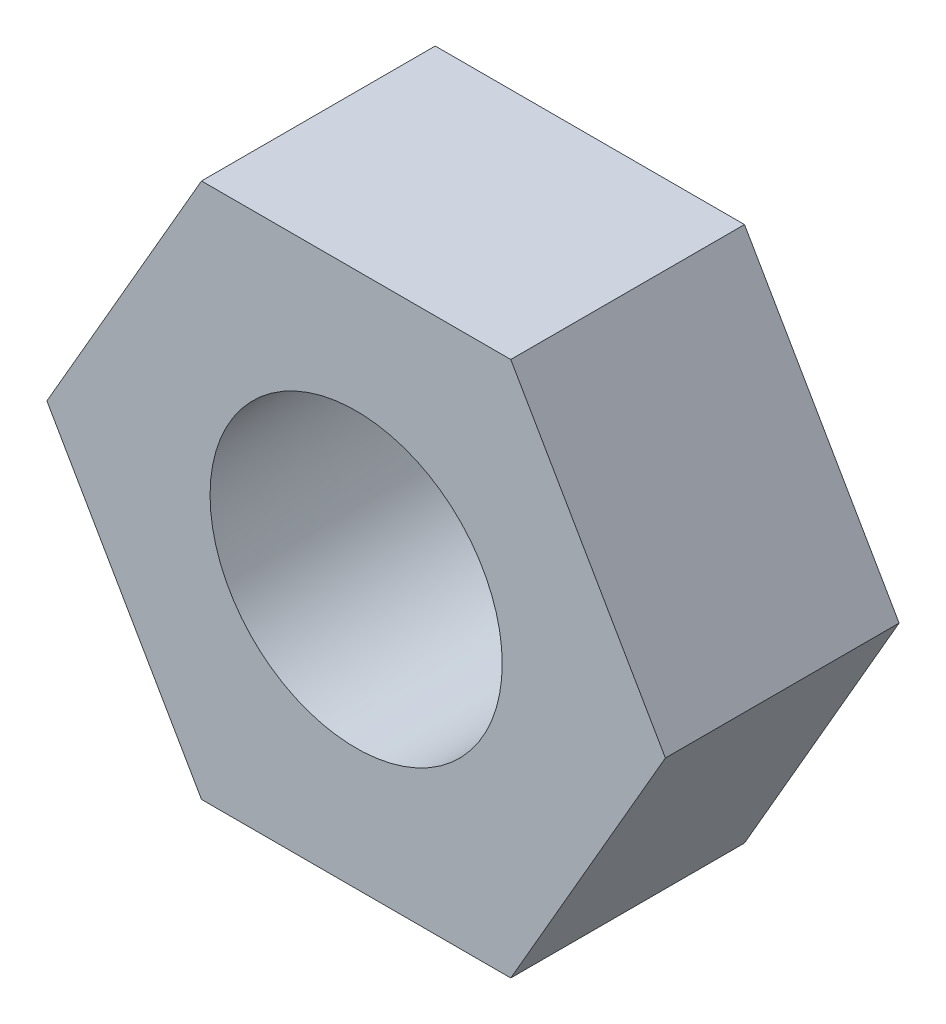
ISO-10303-21;
HEADER;
FILE_DESCRIPTION(('STEP AP214'),'2;1');
FILE_NAME('part.step','',(''),(''),'','','');
FILE_SCHEMA(('AUTOMOTIVE_DESIGN { 1 0 10303 214 1 1 1 1 }'));
ENDSEC;
DATA;
#1=APPLICATION_CONTEXT('core data for automotive mechanical design processes');
#2=APPLICATION_PROTOCOL_DEFINITION('international standard','automotive_design',2000,#1);
#3=PRODUCT_CONTEXT('',#1,'mechanical');
#4=PRODUCT('Part','Part','',(#3));
#5=PRODUCT_RELATED_PRODUCT_CATEGORY('part','',(#4));
#6=PRODUCT_DEFINITION_FORMATION('','',#4);
#7=PRODUCT_DEFINITION_CONTEXT('part definition',#1,'design');
#8=PRODUCT_DEFINITION('design','',#6,#7);
#9=PRODUCT_DEFINITION_SHAPE('','',#8);
#10=(LENGTH_UNIT() NAMED_UNIT(*) SI_UNIT(.MILLI.,.METRE.));
#11=(NAMED_UNIT(*) PLANE_ANGLE_UNIT() SI_UNIT($,.RADIAN.));
#12=(NAMED_UNIT(*) SI_UNIT($,.STERADIAN.) SOLID_ANGLE_UNIT());
#13=UNCERTAINTY_MEASURE_WITH_UNIT(LENGTH_MEASURE(1.E-05),#10,'distance_accuracy_value','');
#14=(GEOMETRIC_REPRESENTATION_CONTEXT(3) GLOBAL_UNCERTAINTY_ASSIGNED_CONTEXT((#13)) GLOBAL_UNIT_ASSIGNED_CONTEXT((#10,
#11,#12)) REPRESENTATION_CONTEXT('',''));
#15=CARTESIAN_POINT('',(0.,0.,0.));
#16=DIRECTION('',(0.,0.,1.));
#17=DIRECTION('',(1.,0.,0.));
#18=AXIS2_PLACEMENT_3D('',#15,#16,#17);
#19=CARTESIAN_POINT('',(0.,0.,2.4));
#20=DIRECTION('',(0.,0.,1.));
#21=DIRECTION('',(1.,0.,0.));
#22=AXIS2_PLACEMENT_3D('',#19,#20,#21);
#23=PLANE('',#22);
#24=DIRECTION('',(0.5,0.866025403784439,0.));
#25=VECTOR('',#24,1.);
#26=CARTESIAN_POINT('',(1.58771324027147,-2.75,2.4));
#27=LINE('',#26,#25);
#28=CARTESIAN_POINT('',(1.58771324027147,-2.75,2.4));
#29=VERTEX_POINT('',#28);
#30=CARTESIAN_POINT('',(3.17542648054294,0.,2.4));
#31=VERTEX_POINT('',#30);
#32=EDGE_CURVE('E130',#29,#31,#27,.T.);
#33=ORIENTED_EDGE('',*,*,#32,.T.);
#34=DIRECTION('',(-0.5,0.866025403784438,0.));
#35=VECTOR('',#34,1.);
#36=CARTESIAN_POINT('',(3.17542648054294,0.,2.4));
#37=LINE('',#36,#35);
#38=CARTESIAN_POINT('',(1.58771324027147,2.75,2.4));
#39=VERTEX_POINT('',#38);
#40=EDGE_CURVE('E88',#31,#39,#37,.T.);
#41=ORIENTED_EDGE('',*,*,#40,.T.);
#42=DIRECTION('',(-1.,0.,0.));
#43=VECTOR('',#42,1.);
#44=CARTESIAN_POINT('',(1.58771324027147,2.75,2.4));
#45=LINE('',#44,#43);
#46=CARTESIAN_POINT('',(-1.58771324027147,2.75,2.4));
#47=VERTEX_POINT('',#46);
#48=EDGE_CURVE('E101',#39,#47,#45,.T.);
#49=ORIENTED_EDGE('',*,*,#48,.T.);
#50=DIRECTION('',(-0.5,-0.866025403784439,0.));
#51=VECTOR('',#50,1.);
#52=CARTESIAN_POINT('',(-1.58771324027147,2.75,2.4));
#53=LINE('',#52,#51);
#54=CARTESIAN_POINT('',(-3.17542648054294,0.,2.4));
#55=VERTEX_POINT('',#54);
#56=EDGE_CURVE('E95',#47,#55,#53,.T.);
#57=ORIENTED_EDGE('',*,*,#56,.T.);
#58=DIRECTION('',(0.5,-0.866025403784439,0.));
#59=VECTOR('',#58,1.);
#60=CARTESIAN_POINT('',(-3.17542648054294,0.,2.4));
#61=LINE('',#60,#59);
#62=CARTESIAN_POINT('',(-1.58771324027147,-2.75,2.4));
#63=VERTEX_POINT('',#62);
#64=EDGE_CURVE('E99',#55,#63,#61,.T.);
#65=ORIENTED_EDGE('',*,*,#64,.T.);
#66=DIRECTION('',(1.,0.,0.));
#67=VECTOR('',#66,1.);
#68=CARTESIAN_POINT('',(-1.58771324027147,-2.75,2.4));
#69=LINE('',#68,#67);
#70=EDGE_CURVE('E51',#63,#29,#69,.T.);
#71=ORIENTED_EDGE('',*,*,#70,.T.);
#72=EDGE_LOOP('',(#33,#41,#49,#57,#65,#71));
#73=FACE_BOUND('',#72,.T.);
#74=CARTESIAN_POINT('',(0.,0.,2.4));
#75=DIRECTION('',(0.,0.,1.));
#76=DIRECTION('',(1.,0.,0.));
#77=AXIS2_PLACEMENT_3D('',#74,#75,#76);
#78=CIRCLE('',#77,1.5);
#79=CARTESIAN_POINT('',(1.5,0.,2.4));
#80=VERTEX_POINT('',#79);
#81=EDGE_CURVE('E123',#80,#80,#78,.T.);
#82=ORIENTED_EDGE('',*,*,#81,.F.);
#83=EDGE_LOOP('',(#82));
#84=FACE_BOUND('',#83,.T.);
#85=ADVANCED_FACE('F34',(#73,#84),#23,.T.);
#86=CARTESIAN_POINT('',(0.,0.,0.));
#87=DIRECTION('',(0.,0.,1.));
#88=DIRECTION('',(1.,0.,0.));
#89=AXIS2_PLACEMENT_3D('',#86,#87,#88);
#90=PLANE('',#89);
#91=DIRECTION('',(0.5,0.866025403784439,0.));
#92=VECTOR('',#91,1.);
#93=CARTESIAN_POINT('',(1.58771324027147,-2.75,0.));
#94=LINE('',#93,#92);
#95=CARTESIAN_POINT('',(1.58771324027147,-2.75,0.));
#96=VERTEX_POINT('',#95);
#97=CARTESIAN_POINT('',(3.17542648054294,0.,0.));
#98=VERTEX_POINT('',#97);
#99=EDGE_CURVE('E119',#96,#98,#94,.T.);
#100=ORIENTED_EDGE('',*,*,#99,.F.);
#101=DIRECTION('',(1.,0.,0.));
#102=VECTOR('',#101,1.);
#103=CARTESIAN_POINT('',(-1.58771324027147,-2.75,0.));
#104=LINE('',#103,#102);
#105=CARTESIAN_POINT('',(-1.58771324027147,-2.75,0.));
#106=VERTEX_POINT('',#105);
#107=EDGE_CURVE('E80',#106,#96,#104,.T.);
#108=ORIENTED_EDGE('',*,*,#107,.F.);
#109=DIRECTION('',(0.5,-0.866025403784439,0.));
#110=VECTOR('',#109,1.);
#111=CARTESIAN_POINT('',(-3.17542648054294,0.,0.));
#112=LINE('',#111,#110);
#113=CARTESIAN_POINT('',(-3.17542648054294,0.,0.));
#114=VERTEX_POINT('',#113);
#115=EDGE_CURVE('E74',#114,#106,#112,.T.);
#116=ORIENTED_EDGE('',*,*,#115,.F.);
#117=DIRECTION('',(-0.5,-0.866025403784439,0.));
#118=VECTOR('',#117,1.);
#119=CARTESIAN_POINT('',(-1.58771324027147,2.75,0.));
#120=LINE('',#119,#118);
#121=CARTESIAN_POINT('',(-1.58771324027147,2.75,0.));
#122=VERTEX_POINT('',#121);
#123=EDGE_CURVE('E109',#122,#114,#120,.T.);
#124=ORIENTED_EDGE('',*,*,#123,.F.);
#125=DIRECTION('',(-1.,0.,0.));
#126=VECTOR('',#125,1.);
#127=CARTESIAN_POINT('',(1.58771324027147,2.75,0.));
#128=LINE('',#127,#126);
#129=CARTESIAN_POINT('',(1.58771324027147,2.75,0.));
#130=VERTEX_POINT('',#129);
#131=EDGE_CURVE('E125',#130,#122,#128,.T.);
#132=ORIENTED_EDGE('',*,*,#131,.F.);
#133=DIRECTION('',(-0.5,0.866025403784438,0.));
#134=VECTOR('',#133,1.);
#135=CARTESIAN_POINT('',(3.17542648054294,0.,0.));
#136=LINE('',#135,#134);
#137=EDGE_CURVE('E122',#98,#130,#136,.T.);
#138=ORIENTED_EDGE('',*,*,#137,.F.);
#139=EDGE_LOOP('',(#100,#108,#116,#124,#132,#138));
#140=FACE_BOUND('',#139,.T.);
#141=CARTESIAN_POINT('',(0.,0.,0.));
#142=DIRECTION('',(0.,0.,1.));
#143=DIRECTION('',(1.,0.,0.));
#144=AXIS2_PLACEMENT_3D('',#141,#142,#143);
#145=CIRCLE('',#144,1.5);
#146=CARTESIAN_POINT('',(1.5,0.,0.));
#147=VERTEX_POINT('',#146);
#148=EDGE_CURVE('E223',#147,#147,#145,.T.);
#149=ORIENTED_EDGE('',*,*,#148,.T.);
#150=EDGE_LOOP('',(#149));
#151=FACE_BOUND('',#150,.T.);
#152=ADVANCED_FACE('F139',(#140,#151),#90,.F.);
#153=CARTESIAN_POINT('',(1.58771324027147,-2.75,2.4));
#154=DIRECTION('',(-0.866025403784439,0.5,0.));
#155=DIRECTION('',(-0.5,-0.866025403784439,0.));
#156=AXIS2_PLACEMENT_3D('',#153,#154,#155);
#157=PLANE('',#156);
#158=ORIENTED_EDGE('',*,*,#99,.T.);
#159=DIRECTION('',(0.,0.,-1.));
#160=VECTOR('',#159,1.);
#161=CARTESIAN_POINT('',(3.17542648054294,0.,2.4));
#162=LINE('',#161,#160);
#163=EDGE_CURVE('E11',#31,#98,#162,.T.);
#164=ORIENTED_EDGE('',*,*,#163,.F.);
#165=ORIENTED_EDGE('',*,*,#32,.F.);
#166=DIRECTION('',(0.,0.,-1.));
#167=VECTOR('',#166,1.);
#168=CARTESIAN_POINT('',(1.58771324027147,-2.75,2.4));
#169=LINE('',#168,#167);
#170=EDGE_CURVE('E115',#29,#96,#169,.T.);
#171=ORIENTED_EDGE('',*,*,#170,.T.);
#172=EDGE_LOOP('',(#158,#164,#165,#171));
#173=FACE_BOUND('',#172,.T.);
#174=ADVANCED_FACE('F36',(#173),#157,.F.);
#175=CARTESIAN_POINT('',(3.17542648054294,0.,2.4));
#176=DIRECTION('',(-0.866025403784439,-0.5,0.));
#177=DIRECTION('',(0.5,-0.866025403784439,0.));
#178=AXIS2_PLACEMENT_3D('',#175,#176,#177);
#179=PLANE('',#178);
#180=ORIENTED_EDGE('',*,*,#137,.T.);
#181=DIRECTION('',(0.,0.,-1.));
#182=VECTOR('',#181,1.);
#183=CARTESIAN_POINT('',(1.58771324027147,2.75,2.4));
#184=LINE('',#183,#182);
#185=EDGE_CURVE('E43',#39,#130,#184,.T.);
#186=ORIENTED_EDGE('',*,*,#185,.F.);
#187=ORIENTED_EDGE('',*,*,#40,.F.);
#188=ORIENTED_EDGE('',*,*,#163,.T.);
#189=EDGE_LOOP('',(#180,#186,#187,#188));
#190=FACE_BOUND('',#189,.T.);
#191=ADVANCED_FACE('F164',(#190),#179,.F.);
#192=CARTESIAN_POINT('',(1.58771324027147,2.75,2.4));
#193=DIRECTION('',(0.,-1.,0.));
#194=DIRECTION('',(0.,0.,-1.));
#195=AXIS2_PLACEMENT_3D('',#192,#193,#194);
#196=PLANE('',#195);
#197=ORIENTED_EDGE('',*,*,#131,.T.);
#198=DIRECTION('',(0.,0.,-1.));
#199=VECTOR('',#198,1.);
#200=CARTESIAN_POINT('',(-1.58771324027147,2.75,2.4));
#201=LINE('',#200,#199);
#202=EDGE_CURVE('E110',#47,#122,#201,.T.);
#203=ORIENTED_EDGE('',*,*,#202,.F.);
#204=ORIENTED_EDGE('',*,*,#48,.F.);
#205=ORIENTED_EDGE('',*,*,#185,.T.);
#206=EDGE_LOOP('',(#197,#203,#204,#205));
#207=FACE_BOUND('',#206,.T.);
#208=ADVANCED_FACE('F136',(#207),#196,.F.);
#209=CARTESIAN_POINT('',(-1.58771324027147,2.75,2.4));
#210=DIRECTION('',(0.866025403784439,-0.5,0.));
#211=DIRECTION('',(0.5,0.866025403784439,0.));
#212=AXIS2_PLACEMENT_3D('',#209,#210,#211);
#213=PLANE('',#212);
#214=ORIENTED_EDGE('',*,*,#123,.T.);
#215=DIRECTION('',(0.,0.,-1.));
#216=VECTOR('',#215,1.);
#217=CARTESIAN_POINT('',(-3.17542648054294,0.,2.4));
#218=LINE('',#217,#216);
#219=EDGE_CURVE('E106',#55,#114,#218,.T.);
#220=ORIENTED_EDGE('',*,*,#219,.F.);
#221=ORIENTED_EDGE('',*,*,#56,.F.);
#222=ORIENTED_EDGE('',*,*,#202,.T.);
#223=EDGE_LOOP('',(#214,#220,#221,#222));
#224=FACE_BOUND('',#223,.T.);
#225=ADVANCED_FACE('F107',(#224),#213,.F.);
#226=CARTESIAN_POINT('',(-3.17542648054294,0.,2.4));
#227=DIRECTION('',(0.866025403784439,0.5,0.));
#228=DIRECTION('',(-0.5,0.866025403784439,0.));
#229=AXIS2_PLACEMENT_3D('',#226,#227,#228);
#230=PLANE('',#229);
#231=ORIENTED_EDGE('',*,*,#115,.T.);
#232=DIRECTION('',(0.,0.,-1.));
#233=VECTOR('',#232,1.);
#234=CARTESIAN_POINT('',(-1.58771324027147,-2.75,2.4));
#235=LINE('',#234,#233);
#236=EDGE_CURVE('E111',#63,#106,#235,.T.);
#237=ORIENTED_EDGE('',*,*,#236,.F.);
#238=ORIENTED_EDGE('',*,*,#64,.F.);
#239=ORIENTED_EDGE('',*,*,#219,.T.);
#240=EDGE_LOOP('',(#231,#237,#238,#239));
#241=FACE_BOUND('',#240,.T.);
#242=ADVANCED_FACE('F113',(#241),#230,.F.);
#243=CARTESIAN_POINT('',(-1.58771324027147,-2.75,2.4));
#244=DIRECTION('',(0.,1.,0.));
#245=DIRECTION('',(-1.,0.,0.));
#246=AXIS2_PLACEMENT_3D('',#243,#244,#245);
#247=PLANE('',#246);
#248=ORIENTED_EDGE('',*,*,#107,.T.);
#249=ORIENTED_EDGE('',*,*,#170,.F.);
#250=ORIENTED_EDGE('',*,*,#70,.F.);
#251=ORIENTED_EDGE('',*,*,#236,.T.);
#252=EDGE_LOOP('',(#248,#249,#250,#251));
#253=FACE_BOUND('',#252,.T.);
#254=ADVANCED_FACE('F144',(#253),#247,.F.);
#255=CARTESIAN_POINT('',(0.,0.,2.4));
#256=DIRECTION('',(0.,0.,-1.));
#257=DIRECTION('',(-1.,0.,0.));
#258=AXIS2_PLACEMENT_3D('',#255,#256,#257);
#259=CYLINDRICAL_SURFACE('',#258,1.5);
#260=ORIENTED_EDGE('',*,*,#81,.T.);
#261=EDGE_LOOP('',(#260));
#262=FACE_BOUND('',#261,.T.);
#263=ORIENTED_EDGE('',*,*,#148,.F.);
#264=EDGE_LOOP('',(#263));
#265=FACE_BOUND('',#264,.T.);
#266=ADVANCED_FACE('F146',(#262,#265),#259,.F.);
#267=CLOSED_SHELL('',(#85,#152,#174,#191,#208,#225,#242,#254,#266));
#268=MANIFOLD_SOLID_BREP('B2',#267);
#269=ADVANCED_BREP_SHAPE_REPRESENTATION('',(#18,#268),#14);
#270=SHAPE_DEFINITION_REPRESENTATION(#9,#269);
ENDSEC;
END-ISO-10303-21;
